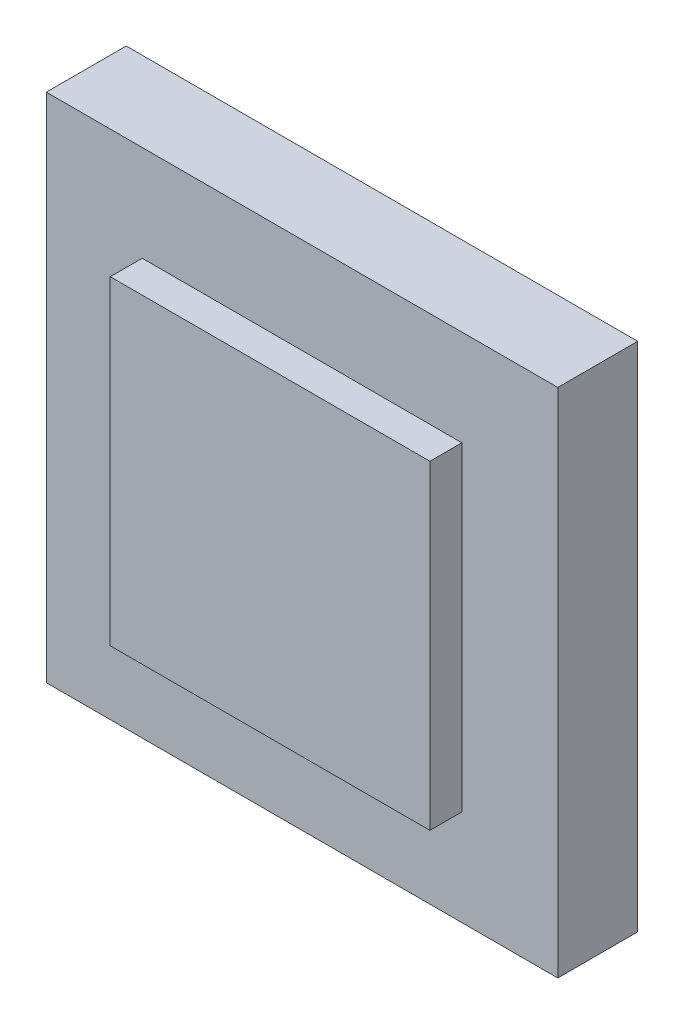
ISO-10303-21;
HEADER;
FILE_DESCRIPTION(('STEP AP214'),'2;1');
FILE_NAME('part.step','',(''),(''),'','','');
FILE_SCHEMA(('AUTOMOTIVE_DESIGN { 1 0 10303 214 1 1 1 1 }'));
ENDSEC;
DATA;
#1=APPLICATION_CONTEXT('core data for automotive mechanical design processes');
#2=APPLICATION_PROTOCOL_DEFINITION('international standard','automotive_design',2000,#1);
#3=PRODUCT_CONTEXT('',#1,'mechanical');
#4=PRODUCT('Part','Part','',(#3));
#5=PRODUCT_RELATED_PRODUCT_CATEGORY('part','',(#4));
#6=PRODUCT_DEFINITION_FORMATION('','',#4);
#7=PRODUCT_DEFINITION_CONTEXT('part definition',#1,'design');
#8=PRODUCT_DEFINITION('design','',#6,#7);
#9=PRODUCT_DEFINITION_SHAPE('','',#8);
#10=(LENGTH_UNIT() NAMED_UNIT(*) SI_UNIT(.MILLI.,.METRE.));
#11=(NAMED_UNIT(*) PLANE_ANGLE_UNIT() SI_UNIT($,.RADIAN.));
#12=(NAMED_UNIT(*) SI_UNIT($,.STERADIAN.) SOLID_ANGLE_UNIT());
#13=UNCERTAINTY_MEASURE_WITH_UNIT(LENGTH_MEASURE(1.E-05),#10,'distance_accuracy_value','');
#14=(GEOMETRIC_REPRESENTATION_CONTEXT(3) GLOBAL_UNCERTAINTY_ASSIGNED_CONTEXT((#13)) GLOBAL_UNIT_ASSIGNED_CONTEXT((#10,
#11,#12)) REPRESENTATION_CONTEXT('',''));
#15=CARTESIAN_POINT('',(0.,0.,0.));
#16=DIRECTION('',(0.,0.,1.));
#17=DIRECTION('',(1.,0.,0.));
#18=AXIS2_PLACEMENT_3D('',#15,#16,#17);
#19=CARTESIAN_POINT('',(203.2,203.2,63.5));
#20=DIRECTION('',(-1.,0.,0.));
#21=DIRECTION('',(0.,-1.,0.));
#22=AXIS2_PLACEMENT_3D('',#19,#20,#21);
#23=PLANE('',#22);
#24=DIRECTION('',(0.,1.,0.));
#25=VECTOR('',#24,1.);
#26=CARTESIAN_POINT('',(203.2,203.2,0.));
#27=LINE('',#26,#25);
#28=CARTESIAN_POINT('',(203.2,-203.2,0.));
#29=VERTEX_POINT('',#28);
#30=CARTESIAN_POINT('',(203.2,203.2,0.));
#31=VERTEX_POINT('',#30);
#32=EDGE_CURVE('E119',#29,#31,#27,.T.);
#33=ORIENTED_EDGE('',*,*,#32,.T.);
#34=DIRECTION('',(0.,0.,-1.));
#35=VECTOR('',#34,1.);
#36=CARTESIAN_POINT('',(203.2,203.2,63.5));
#37=LINE('',#36,#35);
#38=CARTESIAN_POINT('',(203.2,203.2,63.5));
#39=VERTEX_POINT('',#38);
#40=EDGE_CURVE('E11',#39,#31,#37,.T.);
#41=ORIENTED_EDGE('',*,*,#40,.F.);
#42=DIRECTION('',(0.,1.,0.));
#43=VECTOR('',#42,1.);
#44=CARTESIAN_POINT('',(203.2,203.2,63.5));
#45=LINE('',#44,#43);
#46=CARTESIAN_POINT('',(203.2,-203.2,63.5));
#47=VERTEX_POINT('',#46);
#48=EDGE_CURVE('E128',#47,#39,#45,.T.);
#49=ORIENTED_EDGE('',*,*,#48,.F.);
#50=DIRECTION('',(0.,0.,-1.));
#51=VECTOR('',#50,1.);
#52=CARTESIAN_POINT('',(203.2,-203.2,63.5));
#53=LINE('',#52,#51);
#54=EDGE_CURVE('E137',#47,#29,#53,.T.);
#55=ORIENTED_EDGE('',*,*,#54,.T.);
#56=EDGE_LOOP('',(#33,#41,#49,#55));
#57=FACE_BOUND('',#56,.T.);
#58=ADVANCED_FACE('F35',(#57),#23,.F.);
#59=CARTESIAN_POINT('',(-203.2,203.2,63.5));
#60=DIRECTION('',(0.,-1.,0.));
#61=DIRECTION('',(0.,0.,-1.));
#62=AXIS2_PLACEMENT_3D('',#59,#60,#61);
#63=PLANE('',#62);
#64=DIRECTION('',(-1.,0.,0.));
#65=VECTOR('',#64,1.);
#66=CARTESIAN_POINT('',(-203.2,203.2,0.));
#67=LINE('',#66,#65);
#68=CARTESIAN_POINT('',(-203.2,203.2,0.));
#69=VERTEX_POINT('',#68);
#70=EDGE_CURVE('E122',#31,#69,#67,.T.);
#71=ORIENTED_EDGE('',*,*,#70,.T.);
#72=DIRECTION('',(0.,0.,-1.));
#73=VECTOR('',#72,1.);
#74=CARTESIAN_POINT('',(-203.2,203.2,63.5));
#75=LINE('',#74,#73);
#76=CARTESIAN_POINT('',(-203.2,203.2,63.5));
#77=VERTEX_POINT('',#76);
#78=EDGE_CURVE('E42',#77,#69,#75,.T.);
#79=ORIENTED_EDGE('',*,*,#78,.F.);
#80=DIRECTION('',(-1.,0.,0.));
#81=VECTOR('',#80,1.);
#82=CARTESIAN_POINT('',(-203.2,203.2,63.5));
#83=LINE('',#82,#81);
#84=EDGE_CURVE('E131',#39,#77,#83,.T.);
#85=ORIENTED_EDGE('',*,*,#84,.F.);
#86=ORIENTED_EDGE('',*,*,#40,.T.);
#87=EDGE_LOOP('',(#71,#79,#85,#86));
#88=FACE_BOUND('',#87,.T.);
#89=ADVANCED_FACE('F168',(#88),#63,.F.);
#90=CARTESIAN_POINT('',(-203.2,203.2,63.5));
#91=DIRECTION('',(1.,0.,0.));
#92=DIRECTION('',(0.,1.,0.));
#93=AXIS2_PLACEMENT_3D('',#90,#91,#92);
#94=PLANE('',#93);
#95=DIRECTION('',(0.,-1.,0.));
#96=VECTOR('',#95,1.);
#97=CARTESIAN_POINT('',(-203.2,203.2,0.));
#98=LINE('',#97,#96);
#99=CARTESIAN_POINT('',(-203.2,-203.2,0.));
#100=VERTEX_POINT('',#99);
#101=EDGE_CURVE('E140',#69,#100,#98,.T.);
#102=ORIENTED_EDGE('',*,*,#101,.T.);
#103=DIRECTION('',(0.,0.,-1.));
#104=VECTOR('',#103,1.);
#105=CARTESIAN_POINT('',(-203.2,-203.2,63.5));
#106=LINE('',#105,#104);
#107=CARTESIAN_POINT('',(-203.2,-203.2,63.5));
#108=VERTEX_POINT('',#107);
#109=EDGE_CURVE('E145',#108,#100,#106,.T.);
#110=ORIENTED_EDGE('',*,*,#109,.F.);
#111=DIRECTION('',(0.,-1.,0.));
#112=VECTOR('',#111,1.);
#113=CARTESIAN_POINT('',(-203.2,203.2,63.5));
#114=LINE('',#113,#112);
#115=EDGE_CURVE('E134',#77,#108,#114,.T.);
#116=ORIENTED_EDGE('',*,*,#115,.F.);
#117=ORIENTED_EDGE('',*,*,#78,.T.);
#118=EDGE_LOOP('',(#102,#110,#116,#117));
#119=FACE_BOUND('',#118,.T.);
#120=ADVANCED_FACE('F152',(#119),#94,.F.);
#121=CARTESIAN_POINT('',(-203.2,-203.2,63.5));
#122=DIRECTION('',(0.,1.,0.));
#123=DIRECTION('',(0.,0.,1.));
#124=AXIS2_PLACEMENT_3D('',#121,#122,#123);
#125=PLANE('',#124);
#126=DIRECTION('',(1.,0.,0.));
#127=VECTOR('',#126,1.);
#128=CARTESIAN_POINT('',(-203.2,-203.2,0.));
#129=LINE('',#128,#127);
#130=EDGE_CURVE('E132',#100,#29,#129,.T.);
#131=ORIENTED_EDGE('',*,*,#130,.T.);
#132=ORIENTED_EDGE('',*,*,#54,.F.);
#133=DIRECTION('',(1.,0.,0.));
#134=VECTOR('',#133,1.);
#135=CARTESIAN_POINT('',(-203.2,-203.2,63.5));
#136=LINE('',#135,#134);
#137=EDGE_CURVE('E136',#108,#47,#136,.T.);
#138=ORIENTED_EDGE('',*,*,#137,.F.);
#139=ORIENTED_EDGE('',*,*,#109,.T.);
#140=EDGE_LOOP('',(#131,#132,#138,#139));
#141=FACE_BOUND('',#140,.T.);
#142=ADVANCED_FACE('F161',(#141),#125,.F.);
#143=CARTESIAN_POINT('',(0.,0.,63.5));
#144=DIRECTION('',(0.,0.,1.));
#145=DIRECTION('',(1.,0.,0.));
#146=AXIS2_PLACEMENT_3D('',#143,#144,#145);
#147=PLANE('',#146);
#148=DIRECTION('',(0.,1.,0.));
#149=VECTOR('',#148,1.);
#150=CARTESIAN_POINT('',(127.,127.,63.5));
#151=LINE('',#150,#149);
#152=CARTESIAN_POINT('',(127.,-127.,63.5));
#153=VERTEX_POINT('',#152);
#154=CARTESIAN_POINT('',(127.,127.,63.5));
#155=VERTEX_POINT('',#154);
#156=EDGE_CURVE('E49',#153,#155,#151,.T.);
#157=ORIENTED_EDGE('',*,*,#156,.F.);
#158=DIRECTION('',(1.,0.,0.));
#159=VECTOR('',#158,1.);
#160=CARTESIAN_POINT('',(-127.,-127.,63.5));
#161=LINE('',#160,#159);
#162=CARTESIAN_POINT('',(-127.,-127.,63.5));
#163=VERTEX_POINT('',#162);
#164=EDGE_CURVE('E53',#163,#153,#161,.T.);
#165=ORIENTED_EDGE('',*,*,#164,.F.);
#166=DIRECTION('',(0.,-1.,0.));
#167=VECTOR('',#166,1.);
#168=CARTESIAN_POINT('',(-127.,127.,63.5));
#169=LINE('',#168,#167);
#170=CARTESIAN_POINT('',(-127.,127.,63.5));
#171=VERTEX_POINT('',#170);
#172=EDGE_CURVE('E262',#171,#163,#169,.T.);
#173=ORIENTED_EDGE('',*,*,#172,.F.);
#174=DIRECTION('',(-1.,0.,0.));
#175=VECTOR('',#174,1.);
#176=CARTESIAN_POINT('',(-127.,127.,63.5));
#177=LINE('',#176,#175);
#178=EDGE_CURVE('E268',#155,#171,#177,.T.);
#179=ORIENTED_EDGE('',*,*,#178,.F.);
#180=EDGE_LOOP('',(#157,#165,#173,#179));
#181=FACE_BOUND('',#180,.T.);
#182=ORIENTED_EDGE('',*,*,#48,.T.);
#183=ORIENTED_EDGE('',*,*,#84,.T.);
#184=ORIENTED_EDGE('',*,*,#115,.T.);
#185=ORIENTED_EDGE('',*,*,#137,.T.);
#186=EDGE_LOOP('',(#182,#183,#184,#185));
#187=FACE_BOUND('',#186,.T.);
#188=ADVANCED_FACE('F167',(#181,#187),#147,.T.);
#189=CARTESIAN_POINT('',(0.,0.,0.));
#190=DIRECTION('',(0.,0.,1.));
#191=DIRECTION('',(1.,0.,0.));
#192=AXIS2_PLACEMENT_3D('',#189,#190,#191);
#193=PLANE('',#192);
#194=ORIENTED_EDGE('',*,*,#32,.F.);
#195=ORIENTED_EDGE('',*,*,#130,.F.);
#196=ORIENTED_EDGE('',*,*,#101,.F.);
#197=ORIENTED_EDGE('',*,*,#70,.F.);
#198=EDGE_LOOP('',(#194,#195,#196,#197));
#199=FACE_BOUND('',#198,.T.);
#200=ADVANCED_FACE('F158',(#199),#193,.F.);
#201=CARTESIAN_POINT('',(127.,127.,88.9));
#202=DIRECTION('',(-1.,0.,0.));
#203=DIRECTION('',(0.,-1.,0.));
#204=AXIS2_PLACEMENT_3D('',#201,#202,#203);
#205=PLANE('',#204);
#206=ORIENTED_EDGE('',*,*,#156,.T.);
#207=DIRECTION('',(0.,0.,-1.));
#208=VECTOR('',#207,1.);
#209=CARTESIAN_POINT('',(127.,127.,88.9));
#210=LINE('',#209,#208);
#211=CARTESIAN_POINT('',(127.,127.,88.9));
#212=VERTEX_POINT('',#211);
#213=EDGE_CURVE('E102',#212,#155,#210,.T.);
#214=ORIENTED_EDGE('',*,*,#213,.F.);
#215=DIRECTION('',(0.,1.,0.));
#216=VECTOR('',#215,1.);
#217=CARTESIAN_POINT('',(127.,127.,88.9));
#218=LINE('',#217,#216);
#219=CARTESIAN_POINT('',(127.,-127.,88.9));
#220=VERTEX_POINT('',#219);
#221=EDGE_CURVE('E108',#220,#212,#218,.T.);
#222=ORIENTED_EDGE('',*,*,#221,.F.);
#223=DIRECTION('',(0.,0.,-1.));
#224=VECTOR('',#223,1.);
#225=CARTESIAN_POINT('',(127.,-127.,88.9));
#226=LINE('',#225,#224);
#227=EDGE_CURVE('E260',#220,#153,#226,.T.);
#228=ORIENTED_EDGE('',*,*,#227,.T.);
#229=EDGE_LOOP('',(#206,#214,#222,#228));
#230=FACE_BOUND('',#229,.T.);
#231=ADVANCED_FACE('F118',(#230),#205,.F.);
#232=CARTESIAN_POINT('',(-127.,127.,88.9));
#233=DIRECTION('',(0.,-1.,0.));
#234=DIRECTION('',(0.,0.,-1.));
#235=AXIS2_PLACEMENT_3D('',#232,#233,#234);
#236=PLANE('',#235);
#237=ORIENTED_EDGE('',*,*,#178,.T.);
#238=DIRECTION('',(0.,0.,-1.));
#239=VECTOR('',#238,1.);
#240=CARTESIAN_POINT('',(-127.,127.,88.9));
#241=LINE('',#240,#239);
#242=CARTESIAN_POINT('',(-127.,127.,88.9));
#243=VERTEX_POINT('',#242);
#244=EDGE_CURVE('E104',#243,#171,#241,.T.);
#245=ORIENTED_EDGE('',*,*,#244,.F.);
#246=DIRECTION('',(-1.,0.,0.));
#247=VECTOR('',#246,1.);
#248=CARTESIAN_POINT('',(-127.,127.,88.9));
#249=LINE('',#248,#247);
#250=EDGE_CURVE('E97',#212,#243,#249,.T.);
#251=ORIENTED_EDGE('',*,*,#250,.F.);
#252=ORIENTED_EDGE('',*,*,#213,.T.);
#253=EDGE_LOOP('',(#237,#245,#251,#252));
#254=FACE_BOUND('',#253,.T.);
#255=ADVANCED_FACE('F100',(#254),#236,.F.);
#256=CARTESIAN_POINT('',(-127.,127.,88.9));
#257=DIRECTION('',(1.,0.,0.));
#258=DIRECTION('',(0.,1.,0.));
#259=AXIS2_PLACEMENT_3D('',#256,#257,#258);
#260=PLANE('',#259);
#261=ORIENTED_EDGE('',*,*,#172,.T.);
#262=DIRECTION('',(0.,0.,-1.));
#263=VECTOR('',#262,1.);
#264=CARTESIAN_POINT('',(-127.,-127.,88.9));
#265=LINE('',#264,#263);
#266=CARTESIAN_POINT('',(-127.,-127.,88.9));
#267=VERTEX_POINT('',#266);
#268=EDGE_CURVE('E124',#267,#163,#265,.T.);
#269=ORIENTED_EDGE('',*,*,#268,.F.);
#270=DIRECTION('',(0.,-1.,0.));
#271=VECTOR('',#270,1.);
#272=CARTESIAN_POINT('',(-127.,127.,88.9));
#273=LINE('',#272,#271);
#274=EDGE_CURVE('E107',#243,#267,#273,.T.);
#275=ORIENTED_EDGE('',*,*,#274,.F.);
#276=ORIENTED_EDGE('',*,*,#244,.T.);
#277=EDGE_LOOP('',(#261,#269,#275,#276));
#278=FACE_BOUND('',#277,.T.);
#279=ADVANCED_FACE('F186',(#278),#260,.F.);
#280=CARTESIAN_POINT('',(-127.,-127.,88.9));
#281=DIRECTION('',(0.,1.,0.));
#282=DIRECTION('',(0.,0.,1.));
#283=AXIS2_PLACEMENT_3D('',#280,#281,#282);
#284=PLANE('',#283);
#285=ORIENTED_EDGE('',*,*,#164,.T.);
#286=ORIENTED_EDGE('',*,*,#227,.F.);
#287=DIRECTION('',(1.,0.,0.));
#288=VECTOR('',#287,1.);
#289=CARTESIAN_POINT('',(-127.,-127.,88.9));
#290=LINE('',#289,#288);
#291=EDGE_CURVE('E113',#267,#220,#290,.T.);
#292=ORIENTED_EDGE('',*,*,#291,.F.);
#293=ORIENTED_EDGE('',*,*,#268,.T.);
#294=EDGE_LOOP('',(#285,#286,#292,#293));
#295=FACE_BOUND('',#294,.T.);
#296=ADVANCED_FACE('F189',(#295),#284,.F.);
#297=CARTESIAN_POINT('',(0.,0.,88.9));
#298=DIRECTION('',(0.,0.,1.));
#299=DIRECTION('',(1.,0.,0.));
#300=AXIS2_PLACEMENT_3D('',#297,#298,#299);
#301=PLANE('',#300);
#302=ORIENTED_EDGE('',*,*,#221,.T.);
#303=ORIENTED_EDGE('',*,*,#250,.T.);
#304=ORIENTED_EDGE('',*,*,#274,.T.);
#305=ORIENTED_EDGE('',*,*,#291,.T.);
#306=EDGE_LOOP('',(#302,#303,#304,#305));
#307=FACE_BOUND('',#306,.T.);
#308=ADVANCED_FACE('F111',(#307),#301,.T.);
#309=CLOSED_SHELL('',(#58,#89,#120,#142,#188,#200,#231,#255,#279,#296,#308));
#310=MANIFOLD_SOLID_BREP('B2',#309);
#311=ADVANCED_BREP_SHAPE_REPRESENTATION('',(#18,#310),#14);
#312=SHAPE_DEFINITION_REPRESENTATION(#9,#311);
ENDSEC;
END-ISO-10303-21;
